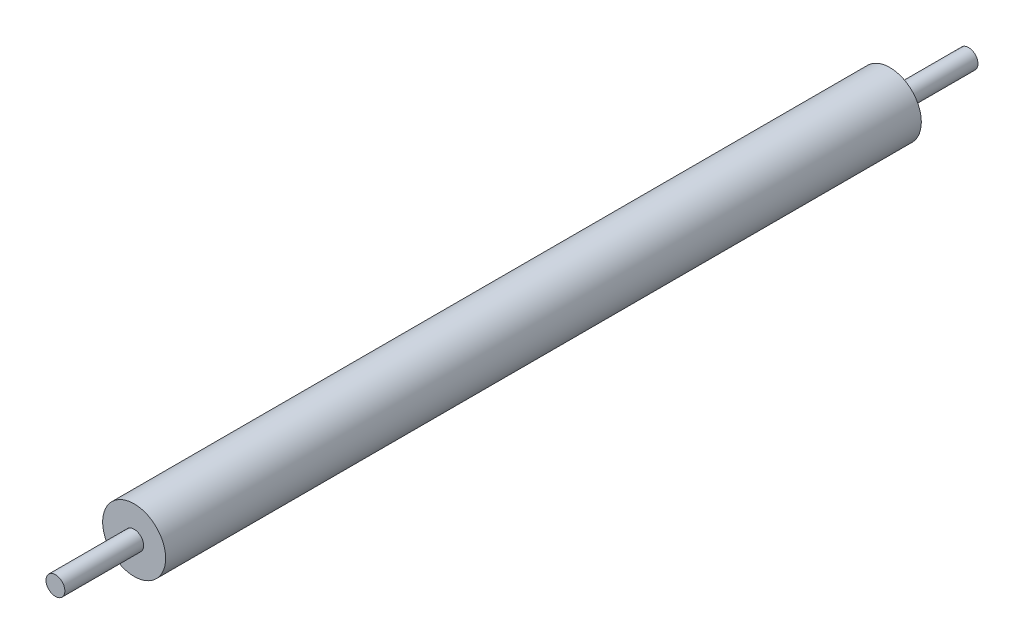
ISO-10303-21;
HEADER;
FILE_DESCRIPTION(('STEP AP214'),'2;1');
FILE_NAME('part.step','',(''),(''),'','','');
FILE_SCHEMA(('AUTOMOTIVE_DESIGN { 1 0 10303 214 1 1 1 1 }'));
ENDSEC;
DATA;
#1=APPLICATION_CONTEXT('core data for automotive mechanical design processes');
#2=APPLICATION_PROTOCOL_DEFINITION('international standard','automotive_design',2000,#1);
#3=PRODUCT_CONTEXT('',#1,'mechanical');
#4=PRODUCT('Part','Part','',(#3));
#5=PRODUCT_RELATED_PRODUCT_CATEGORY('part','',(#4));
#6=PRODUCT_DEFINITION_FORMATION('','',#4);
#7=PRODUCT_DEFINITION_CONTEXT('part definition',#1,'design');
#8=PRODUCT_DEFINITION('design','',#6,#7);
#9=PRODUCT_DEFINITION_SHAPE('','',#8);
#10=(LENGTH_UNIT() NAMED_UNIT(*) SI_UNIT(.MILLI.,.METRE.));
#11=(NAMED_UNIT(*) PLANE_ANGLE_UNIT() SI_UNIT($,.RADIAN.));
#12=(NAMED_UNIT(*) SI_UNIT($,.STERADIAN.) SOLID_ANGLE_UNIT());
#13=UNCERTAINTY_MEASURE_WITH_UNIT(LENGTH_MEASURE(1.E-05),#10,'distance_accuracy_value','');
#14=(GEOMETRIC_REPRESENTATION_CONTEXT(3) GLOBAL_UNCERTAINTY_ASSIGNED_CONTEXT((#13)) GLOBAL_UNIT_ASSIGNED_CONTEXT((#10,
#11,#12)) REPRESENTATION_CONTEXT('',''));
#15=CARTESIAN_POINT('',(0.,0.,0.));
#16=DIRECTION('',(0.,0.,1.));
#17=DIRECTION('',(1.,0.,0.));
#18=AXIS2_PLACEMENT_3D('',#15,#16,#17);
#19=CARTESIAN_POINT('',(0.,0.,600.));
#20=DIRECTION('',(0.,0.,-1.));
#21=DIRECTION('',(-1.,0.,0.));
#22=AXIS2_PLACEMENT_3D('',#19,#20,#21);
#23=CYLINDRICAL_SURFACE('',#22,50.);
#24=CARTESIAN_POINT('',(0.,0.,600.));
#25=DIRECTION('',(0.,0.,1.));
#26=DIRECTION('',(1.,0.,0.));
#27=AXIS2_PLACEMENT_3D('',#24,#25,#26);
#28=CIRCLE('',#27,50.);
#29=CARTESIAN_POINT('',(50.,0.,600.));
#30=VERTEX_POINT('',#29);
#31=EDGE_CURVE('E44',#30,#30,#28,.T.);
#32=ORIENTED_EDGE('',*,*,#31,.F.);
#33=EDGE_LOOP('',(#32));
#34=FACE_BOUND('',#33,.T.);
#35=CARTESIAN_POINT('',(0.,0.,-600.));
#36=DIRECTION('',(0.,0.,1.));
#37=DIRECTION('',(1.,0.,0.));
#38=AXIS2_PLACEMENT_3D('',#35,#36,#37);
#39=CIRCLE('',#38,50.);
#40=CARTESIAN_POINT('',(50.,0.,-600.));
#41=VERTEX_POINT('',#40);
#42=EDGE_CURVE('E40',#41,#41,#39,.T.);
#43=ORIENTED_EDGE('',*,*,#42,.T.);
#44=EDGE_LOOP('',(#43));
#45=FACE_BOUND('',#44,.T.);
#46=ADVANCED_FACE('F37',(#34,#45),#23,.T.);
#47=CARTESIAN_POINT('',(0.,0.,600.));
#48=DIRECTION('',(0.,0.,1.));
#49=DIRECTION('',(1.,0.,0.));
#50=AXIS2_PLACEMENT_3D('',#47,#48,#49);
#51=PLANE('',#50);
#52=CARTESIAN_POINT('',(0.,0.,600.));
#53=DIRECTION('',(0.,0.,1.));
#54=DIRECTION('',(1.,0.,0.));
#55=AXIS2_PLACEMENT_3D('',#52,#53,#54);
#56=CIRCLE('',#55,15.);
#57=CARTESIAN_POINT('',(15.,0.,600.));
#58=VERTEX_POINT('',#57);
#59=EDGE_CURVE('E10',#58,#58,#56,.T.);
#60=ORIENTED_EDGE('',*,*,#59,.F.);
#61=EDGE_LOOP('',(#60));
#62=FACE_BOUND('',#61,.T.);
#63=ORIENTED_EDGE('',*,*,#31,.T.);
#64=EDGE_LOOP('',(#63));
#65=FACE_BOUND('',#64,.T.);
#66=ADVANCED_FACE('F72',(#62,#65),#51,.T.);
#67=CARTESIAN_POINT('',(0.,0.,-600.));
#68=DIRECTION('',(0.,0.,1.));
#69=DIRECTION('',(1.,0.,0.));
#70=AXIS2_PLACEMENT_3D('',#67,#68,#69);
#71=PLANE('',#70);
#72=CARTESIAN_POINT('',(0.,0.,-600.));
#73=DIRECTION('',(0.,0.,1.));
#74=DIRECTION('',(1.,0.,0.));
#75=AXIS2_PLACEMENT_3D('',#72,#73,#74);
#76=CIRCLE('',#75,15.);
#77=CARTESIAN_POINT('',(15.,0.,-600.));
#78=VERTEX_POINT('',#77);
#79=EDGE_CURVE('E54',#78,#78,#76,.T.);
#80=ORIENTED_EDGE('',*,*,#79,.T.);
#81=EDGE_LOOP('',(#80));
#82=FACE_BOUND('',#81,.T.);
#83=ORIENTED_EDGE('',*,*,#42,.F.);
#84=EDGE_LOOP('',(#83));
#85=FACE_BOUND('',#84,.T.);
#86=ADVANCED_FACE('F77',(#82,#85),#71,.F.);
#87=CARTESIAN_POINT('',(0.,0.,725.));
#88=DIRECTION('',(0.,0.,-1.));
#89=DIRECTION('',(-1.,0.,0.));
#90=AXIS2_PLACEMENT_3D('',#87,#88,#89);
#91=CYLINDRICAL_SURFACE('',#90,15.);
#92=CARTESIAN_POINT('',(0.,0.,725.));
#93=DIRECTION('',(0.,0.,1.));
#94=DIRECTION('',(1.,0.,0.));
#95=AXIS2_PLACEMENT_3D('',#92,#93,#94);
#96=CIRCLE('',#95,15.);
#97=CARTESIAN_POINT('',(15.,0.,725.));
#98=VERTEX_POINT('',#97);
#99=EDGE_CURVE('E50',#98,#98,#96,.T.);
#100=ORIENTED_EDGE('',*,*,#99,.F.);
#101=EDGE_LOOP('',(#100));
#102=FACE_BOUND('',#101,.T.);
#103=ORIENTED_EDGE('',*,*,#59,.T.);
#104=EDGE_LOOP('',(#103));
#105=FACE_BOUND('',#104,.T.);
#106=ADVANCED_FACE('F86',(#102,#105),#91,.T.);
#107=CARTESIAN_POINT('',(0.,0.,725.));
#108=DIRECTION('',(0.,0.,1.));
#109=DIRECTION('',(1.,0.,0.));
#110=AXIS2_PLACEMENT_3D('',#107,#108,#109);
#111=PLANE('',#110);
#112=ORIENTED_EDGE('',*,*,#99,.T.);
#113=EDGE_LOOP('',(#112));
#114=FACE_BOUND('',#113,.T.);
#115=ADVANCED_FACE('F69',(#114),#111,.T.);
#116=CARTESIAN_POINT('',(0.,0.,-725.));
#117=DIRECTION('',(0.,0.,1.));
#118=DIRECTION('',(1.,0.,0.));
#119=AXIS2_PLACEMENT_3D('',#116,#117,#118);
#120=CYLINDRICAL_SURFACE('',#119,15.);
#121=CARTESIAN_POINT('',(0.,0.,-725.));
#122=DIRECTION('',(0.,0.,1.));
#123=DIRECTION('',(1.,0.,0.));
#124=AXIS2_PLACEMENT_3D('',#121,#122,#123);
#125=CIRCLE('',#124,15.);
#126=CARTESIAN_POINT('',(15.,0.,-725.));
#127=VERTEX_POINT('',#126);
#128=EDGE_CURVE('E53',#127,#127,#125,.T.);
#129=ORIENTED_EDGE('',*,*,#128,.T.);
#130=EDGE_LOOP('',(#129));
#131=FACE_BOUND('',#130,.T.);
#132=ORIENTED_EDGE('',*,*,#79,.F.);
#133=EDGE_LOOP('',(#132));
#134=FACE_BOUND('',#133,.T.);
#135=ADVANCED_FACE('F60',(#131,#134),#120,.T.);
#136=CARTESIAN_POINT('',(0.,0.,-725.));
#137=DIRECTION('',(0.,0.,-1.));
#138=DIRECTION('',(1.,0.,0.));
#139=AXIS2_PLACEMENT_3D('',#136,#137,#138);
#140=PLANE('',#139);
#141=ORIENTED_EDGE('',*,*,#128,.F.);
#142=EDGE_LOOP('',(#141));
#143=FACE_BOUND('',#142,.T.);
#144=ADVANCED_FACE('F63',(#143),#140,.T.);
#145=CLOSED_SHELL('',(#46,#66,#86,#106,#115,#135,#144));
#146=MANIFOLD_SOLID_BREP('B2',#145);
#147=ADVANCED_BREP_SHAPE_REPRESENTATION('',(#18,#146),#14);
#148=SHAPE_DEFINITION_REPRESENTATION(#9,#147);
ENDSEC;
END-ISO-10303-21;
